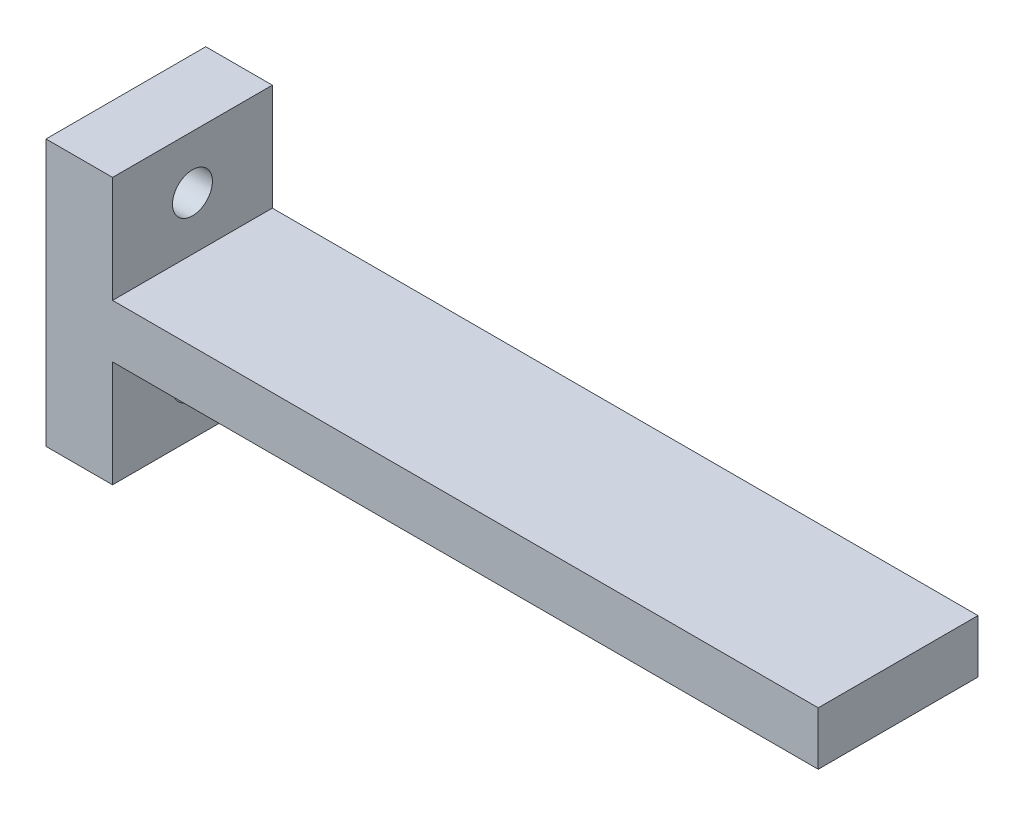
ISO-10303-21;
HEADER;
FILE_DESCRIPTION(('STEP AP214'),'2;1');
FILE_NAME('part.step','',(''),(''),'','','');
FILE_SCHEMA(('AUTOMOTIVE_DESIGN { 1 0 10303 214 1 1 1 1 }'));
ENDSEC;
DATA;
#1=APPLICATION_CONTEXT('core data for automotive mechanical design processes');
#2=APPLICATION_PROTOCOL_DEFINITION('international standard','automotive_design',2000,#1);
#3=PRODUCT_CONTEXT('',#1,'mechanical');
#4=PRODUCT('Part','Part','',(#3));
#5=PRODUCT_RELATED_PRODUCT_CATEGORY('part','',(#4));
#6=PRODUCT_DEFINITION_FORMATION('','',#4);
#7=PRODUCT_DEFINITION_CONTEXT('part definition',#1,'design');
#8=PRODUCT_DEFINITION('design','',#6,#7);
#9=PRODUCT_DEFINITION_SHAPE('','',#8);
#10=(LENGTH_UNIT() NAMED_UNIT(*) SI_UNIT(.MILLI.,.METRE.));
#11=(NAMED_UNIT(*) PLANE_ANGLE_UNIT() SI_UNIT($,.RADIAN.));
#12=(NAMED_UNIT(*) SI_UNIT($,.STERADIAN.) SOLID_ANGLE_UNIT());
#13=UNCERTAINTY_MEASURE_WITH_UNIT(LENGTH_MEASURE(1.E-05),#10,'distance_accuracy_value','');
#14=(GEOMETRIC_REPRESENTATION_CONTEXT(3) GLOBAL_UNCERTAINTY_ASSIGNED_CONTEXT((#13)) GLOBAL_UNIT_ASSIGNED_CONTEXT((#10,
#11,#12)) REPRESENTATION_CONTEXT('',''));
#15=CARTESIAN_POINT('',(0.,0.,0.));
#16=DIRECTION('',(0.,0.,1.));
#17=DIRECTION('',(1.,0.,0.));
#18=AXIS2_PLACEMENT_3D('',#15,#16,#17);
#19=CARTESIAN_POINT('',(-26.5,2.,6.));
#20=DIRECTION('',(0.,0.,-1.));
#21=DIRECTION('',(-1.,0.,0.));
#22=AXIS2_PLACEMENT_3D('',#19,#20,#21);
#23=PLANE('',#22);
#24=DIRECTION('',(1.,0.,0.));
#25=VECTOR('',#24,1.);
#26=CARTESIAN_POINT('',(-26.5,-2.,6.));
#27=LINE('',#26,#25);
#28=CARTESIAN_POINT('',(-26.5,-2.,6.));
#29=VERTEX_POINT('',#28);
#30=CARTESIAN_POINT('',(26.5,-2.,6.));
#31=VERTEX_POINT('',#30);
#32=EDGE_CURVE('E62',#29,#31,#27,.T.);
#33=ORIENTED_EDGE('',*,*,#32,.T.);
#34=DIRECTION('',(0.,-1.,0.));
#35=VECTOR('',#34,1.);
#36=CARTESIAN_POINT('',(26.5,2.,6.));
#37=LINE('',#36,#35);
#38=CARTESIAN_POINT('',(26.5,2.,6.));
#39=VERTEX_POINT('',#38);
#40=EDGE_CURVE('E11',#39,#31,#37,.T.);
#41=ORIENTED_EDGE('',*,*,#40,.F.);
#42=DIRECTION('',(1.,0.,0.));
#43=VECTOR('',#42,1.);
#44=CARTESIAN_POINT('',(-26.5,2.,6.));
#45=LINE('',#44,#43);
#46=CARTESIAN_POINT('',(-26.5,2.,6.));
#47=VERTEX_POINT('',#46);
#48=EDGE_CURVE('E96',#47,#39,#45,.T.);
#49=ORIENTED_EDGE('',*,*,#48,.F.);
#50=DIRECTION('',(0.,1.,0.));
#51=VECTOR('',#50,1.);
#52=CARTESIAN_POINT('',(-26.5,10.,6.));
#53=LINE('',#52,#51);
#54=CARTESIAN_POINT('',(-26.5,10.,6.));
#55=VERTEX_POINT('',#54);
#56=EDGE_CURVE('E80',#47,#55,#53,.T.);
#57=ORIENTED_EDGE('',*,*,#56,.T.);
#58=DIRECTION('',(1.,0.,0.));
#59=VECTOR('',#58,1.);
#60=CARTESIAN_POINT('',(-31.5,10.,6.));
#61=LINE('',#60,#59);
#62=CARTESIAN_POINT('',(-31.5,10.,6.));
#63=VERTEX_POINT('',#62);
#64=EDGE_CURVE('E197',#63,#55,#61,.T.);
#65=ORIENTED_EDGE('',*,*,#64,.F.);
#66=DIRECTION('',(0.,1.,0.));
#67=VECTOR('',#66,1.);
#68=CARTESIAN_POINT('',(-31.5,10.,6.));
#69=LINE('',#68,#67);
#70=CARTESIAN_POINT('',(-31.5,-10.,6.));
#71=VERTEX_POINT('',#70);
#72=EDGE_CURVE('E183',#71,#63,#69,.T.);
#73=ORIENTED_EDGE('',*,*,#72,.F.);
#74=DIRECTION('',(1.,0.,0.));
#75=VECTOR('',#74,1.);
#76=CARTESIAN_POINT('',(-31.5,-10.,6.));
#77=LINE('',#76,#75);
#78=CARTESIAN_POINT('',(-26.5,-10.,6.));
#79=VERTEX_POINT('',#78);
#80=EDGE_CURVE('E198',#71,#79,#77,.T.);
#81=ORIENTED_EDGE('',*,*,#80,.T.);
#82=EDGE_CURVE('E93',#79,#29,#53,.T.);
#83=ORIENTED_EDGE('',*,*,#82,.T.);
#84=EDGE_LOOP('',(#33,#41,#49,#57,#65,#73,#81,#83));
#85=FACE_BOUND('',#84,.T.);
#86=ADVANCED_FACE('F34',(#85),#23,.F.);
#87=CARTESIAN_POINT('',(26.5,2.,-6.));
#88=DIRECTION('',(-1.,0.,0.));
#89=DIRECTION('',(0.,0.,1.));
#90=AXIS2_PLACEMENT_3D('',#87,#88,#89);
#91=PLANE('',#90);
#92=DIRECTION('',(0.,0.,-1.));
#93=VECTOR('',#92,1.);
#94=CARTESIAN_POINT('',(26.5,-2.,-6.));
#95=LINE('',#94,#93);
#96=CARTESIAN_POINT('',(26.5,-2.,-6.));
#97=VERTEX_POINT('',#96);
#98=EDGE_CURVE('E104',#31,#97,#95,.T.);
#99=ORIENTED_EDGE('',*,*,#98,.T.);
#100=DIRECTION('',(0.,-1.,0.));
#101=VECTOR('',#100,1.);
#102=CARTESIAN_POINT('',(26.5,2.,-6.));
#103=LINE('',#102,#101);
#104=CARTESIAN_POINT('',(26.5,2.,-6.));
#105=VERTEX_POINT('',#104);
#106=EDGE_CURVE('E42',#105,#97,#103,.T.);
#107=ORIENTED_EDGE('',*,*,#106,.F.);
#108=DIRECTION('',(0.,0.,-1.));
#109=VECTOR('',#108,1.);
#110=CARTESIAN_POINT('',(26.5,2.,-6.));
#111=LINE('',#110,#109);
#112=EDGE_CURVE('E50',#39,#105,#111,.T.);
#113=ORIENTED_EDGE('',*,*,#112,.F.);
#114=ORIENTED_EDGE('',*,*,#40,.T.);
#115=EDGE_LOOP('',(#99,#107,#113,#114));
#116=FACE_BOUND('',#115,.T.);
#117=ADVANCED_FACE('F123',(#116),#91,.F.);
#118=CARTESIAN_POINT('',(-26.5,2.,-6.));
#119=DIRECTION('',(0.,0.,1.));
#120=DIRECTION('',(1.,0.,0.));
#121=AXIS2_PLACEMENT_3D('',#118,#119,#120);
#122=PLANE('',#121);
#123=DIRECTION('',(-1.,0.,0.));
#124=VECTOR('',#123,1.);
#125=CARTESIAN_POINT('',(-26.5,-2.,-6.));
#126=LINE('',#125,#124);
#127=CARTESIAN_POINT('',(-26.5,-2.,-6.));
#128=VERTEX_POINT('',#127);
#129=EDGE_CURVE('E101',#97,#128,#126,.T.);
#130=ORIENTED_EDGE('',*,*,#129,.T.);
#131=DIRECTION('',(0.,-1.,0.));
#132=VECTOR('',#131,1.);
#133=CARTESIAN_POINT('',(-26.5,10.,-6.));
#134=LINE('',#133,#132);
#135=CARTESIAN_POINT('',(-26.5,-10.,-6.));
#136=VERTEX_POINT('',#135);
#137=EDGE_CURVE('E174',#128,#136,#134,.T.);
#138=ORIENTED_EDGE('',*,*,#137,.T.);
#139=DIRECTION('',(1.,0.,0.));
#140=VECTOR('',#139,1.);
#141=CARTESIAN_POINT('',(-31.5,-10.,-6.));
#142=LINE('',#141,#140);
#143=CARTESIAN_POINT('',(-31.5,-10.,-6.));
#144=VERTEX_POINT('',#143);
#145=EDGE_CURVE('E107',#144,#136,#142,.T.);
#146=ORIENTED_EDGE('',*,*,#145,.F.);
#147=DIRECTION('',(0.,-1.,0.));
#148=VECTOR('',#147,1.);
#149=CARTESIAN_POINT('',(-31.5,10.,-6.));
#150=LINE('',#149,#148);
#151=CARTESIAN_POINT('',(-31.5,10.,-6.));
#152=VERTEX_POINT('',#151);
#153=EDGE_CURVE('E177',#152,#144,#150,.T.);
#154=ORIENTED_EDGE('',*,*,#153,.F.);
#155=DIRECTION('',(1.,0.,0.));
#156=VECTOR('',#155,1.);
#157=CARTESIAN_POINT('',(-31.5,10.,-6.));
#158=LINE('',#157,#156);
#159=CARTESIAN_POINT('',(-26.5,10.,-6.));
#160=VERTEX_POINT('',#159);
#161=EDGE_CURVE('E189',#152,#160,#158,.T.);
#162=ORIENTED_EDGE('',*,*,#161,.T.);
#163=CARTESIAN_POINT('',(-26.5,2.,-6.));
#164=VERTEX_POINT('',#163);
#165=EDGE_CURVE('E190',#160,#164,#134,.T.);
#166=ORIENTED_EDGE('',*,*,#165,.T.);
#167=DIRECTION('',(-1.,0.,0.));
#168=VECTOR('',#167,1.);
#169=CARTESIAN_POINT('',(-26.5,2.,-6.));
#170=LINE('',#169,#168);
#171=EDGE_CURVE('E100',#105,#164,#170,.T.);
#172=ORIENTED_EDGE('',*,*,#171,.F.);
#173=ORIENTED_EDGE('',*,*,#106,.T.);
#174=EDGE_LOOP('',(#130,#138,#146,#154,#162,#166,#172,#173));
#175=FACE_BOUND('',#174,.T.);
#176=ADVANCED_FACE('F117',(#175),#122,.F.);
#177=CARTESIAN_POINT('',(0.,2.,0.));
#178=DIRECTION('',(0.,1.,0.));
#179=DIRECTION('',(0.,0.,1.));
#180=AXIS2_PLACEMENT_3D('',#177,#178,#179);
#181=PLANE('',#180);
#182=DIRECTION('',(0.,0.,1.));
#183=VECTOR('',#182,1.);
#184=CARTESIAN_POINT('',(-26.5,2.,-6.));
#185=LINE('',#184,#183);
#186=EDGE_CURVE('E86',#164,#47,#185,.T.);
#187=ORIENTED_EDGE('',*,*,#186,.T.);
#188=ORIENTED_EDGE('',*,*,#48,.T.);
#189=ORIENTED_EDGE('',*,*,#112,.T.);
#190=ORIENTED_EDGE('',*,*,#171,.T.);
#191=EDGE_LOOP('',(#187,#188,#189,#190));
#192=FACE_BOUND('',#191,.T.);
#193=ADVANCED_FACE('F98',(#192),#181,.T.);
#194=CARTESIAN_POINT('',(0.,-2.,0.));
#195=DIRECTION('',(0.,1.,0.));
#196=DIRECTION('',(0.,0.,1.));
#197=AXIS2_PLACEMENT_3D('',#194,#195,#196);
#198=PLANE('',#197);
#199=DIRECTION('',(0.,0.,1.));
#200=VECTOR('',#199,1.);
#201=CARTESIAN_POINT('',(-26.5,-2.,-6.));
#202=LINE('',#201,#200);
#203=EDGE_CURVE('E71',#128,#29,#202,.T.);
#204=ORIENTED_EDGE('',*,*,#203,.F.);
#205=ORIENTED_EDGE('',*,*,#129,.F.);
#206=ORIENTED_EDGE('',*,*,#98,.F.);
#207=ORIENTED_EDGE('',*,*,#32,.F.);
#208=EDGE_LOOP('',(#204,#205,#206,#207));
#209=FACE_BOUND('',#208,.T.);
#210=ADVANCED_FACE('F122',(#209),#198,.F.);
#211=CARTESIAN_POINT('',(-26.5,0.,0.));
#212=DIRECTION('',(-1.,0.,0.));
#213=DIRECTION('',(0.,0.,1.));
#214=AXIS2_PLACEMENT_3D('',#211,#212,#213);
#215=PLANE('',#214);
#216=CARTESIAN_POINT('',(-26.5,-6.,0.));
#217=DIRECTION('',(-1.,0.,0.));
#218=DIRECTION('',(0.,0.,1.));
#219=AXIS2_PLACEMENT_3D('',#216,#217,#218);
#220=CIRCLE('',#219,1.5);
#221=CARTESIAN_POINT('',(-26.5,-6.,1.5));
#222=VERTEX_POINT('',#221);
#223=EDGE_CURVE('E165',#222,#222,#220,.T.);
#224=ORIENTED_EDGE('',*,*,#223,.T.);
#225=EDGE_LOOP('',(#224));
#226=FACE_BOUND('',#225,.T.);
#227=ORIENTED_EDGE('',*,*,#137,.F.);
#228=ORIENTED_EDGE('',*,*,#203,.T.);
#229=ORIENTED_EDGE('',*,*,#82,.F.);
#230=DIRECTION('',(0.,0.,1.));
#231=VECTOR('',#230,1.);
#232=CARTESIAN_POINT('',(-26.5,-10.,-6.));
#233=LINE('',#232,#231);
#234=EDGE_CURVE('E94',#136,#79,#233,.T.);
#235=ORIENTED_EDGE('',*,*,#234,.F.);
#236=EDGE_LOOP('',(#227,#228,#229,#235));
#237=FACE_BOUND('',#236,.T.);
#238=ADVANCED_FACE('F133',(#226,#237),#215,.F.);
#239=CARTESIAN_POINT('',(-31.5,0.,0.));
#240=DIRECTION('',(-1.,0.,0.));
#241=DIRECTION('',(0.,0.,1.));
#242=AXIS2_PLACEMENT_3D('',#239,#240,#241);
#243=PLANE('',#242);
#244=CARTESIAN_POINT('',(-31.5,6.,0.));
#245=DIRECTION('',(-1.,0.,0.));
#246=DIRECTION('',(0.,0.,1.));
#247=AXIS2_PLACEMENT_3D('',#244,#245,#246);
#248=CIRCLE('',#247,1.5);
#249=CARTESIAN_POINT('',(-31.5,6.,1.5));
#250=VERTEX_POINT('',#249);
#251=EDGE_CURVE('E171',#250,#250,#248,.T.);
#252=ORIENTED_EDGE('',*,*,#251,.F.);
#253=EDGE_LOOP('',(#252));
#254=FACE_BOUND('',#253,.T.);
#255=ORIENTED_EDGE('',*,*,#153,.T.);
#256=DIRECTION('',(0.,0.,1.));
#257=VECTOR('',#256,1.);
#258=CARTESIAN_POINT('',(-31.5,-10.,-6.));
#259=LINE('',#258,#257);
#260=EDGE_CURVE('E180',#144,#71,#259,.T.);
#261=ORIENTED_EDGE('',*,*,#260,.T.);
#262=ORIENTED_EDGE('',*,*,#72,.T.);
#263=DIRECTION('',(0.,0.,-1.));
#264=VECTOR('',#263,1.);
#265=CARTESIAN_POINT('',(-31.5,10.,-6.));
#266=LINE('',#265,#264);
#267=EDGE_CURVE('E186',#63,#152,#266,.T.);
#268=ORIENTED_EDGE('',*,*,#267,.T.);
#269=EDGE_LOOP('',(#255,#261,#262,#268));
#270=FACE_BOUND('',#269,.T.);
#271=CARTESIAN_POINT('',(-31.5,-6.,0.));
#272=DIRECTION('',(-1.,0.,0.));
#273=DIRECTION('',(0.,0.,1.));
#274=AXIS2_PLACEMENT_3D('',#271,#272,#273);
#275=CIRCLE('',#274,1.5);
#276=CARTESIAN_POINT('',(-31.5,-6.,1.5));
#277=VERTEX_POINT('',#276);
#278=EDGE_CURVE('E162',#277,#277,#275,.T.);
#279=ORIENTED_EDGE('',*,*,#278,.F.);
#280=EDGE_LOOP('',(#279));
#281=FACE_BOUND('',#280,.T.);
#282=ADVANCED_FACE('F147',(#254,#270,#281),#243,.T.);
#283=ORIENTED_EDGE('',*,*,#186,.F.);
#284=ORIENTED_EDGE('',*,*,#165,.F.);
#285=DIRECTION('',(0.,0.,-1.));
#286=VECTOR('',#285,1.);
#287=CARTESIAN_POINT('',(-26.5,10.,-6.));
#288=LINE('',#287,#286);
#289=EDGE_CURVE('E90',#55,#160,#288,.T.);
#290=ORIENTED_EDGE('',*,*,#289,.F.);
#291=ORIENTED_EDGE('',*,*,#56,.F.);
#292=EDGE_LOOP('',(#283,#284,#290,#291));
#293=FACE_BOUND('',#292,.T.);
#294=CARTESIAN_POINT('',(-26.5,6.,0.));
#295=DIRECTION('',(-1.,0.,0.));
#296=DIRECTION('',(0.,0.,1.));
#297=AXIS2_PLACEMENT_3D('',#294,#295,#296);
#298=CIRCLE('',#297,1.5);
#299=CARTESIAN_POINT('',(-26.5,6.,1.5));
#300=VERTEX_POINT('',#299);
#301=EDGE_CURVE('E168',#300,#300,#298,.T.);
#302=ORIENTED_EDGE('',*,*,#301,.T.);
#303=EDGE_LOOP('',(#302));
#304=FACE_BOUND('',#303,.T.);
#305=ADVANCED_FACE('F82',(#293,#304),#215,.F.);
#306=CARTESIAN_POINT('',(-31.5,-10.,-6.));
#307=DIRECTION('',(0.,1.,0.));
#308=DIRECTION('',(0.,0.,1.));
#309=AXIS2_PLACEMENT_3D('',#306,#307,#308);
#310=PLANE('',#309);
#311=ORIENTED_EDGE('',*,*,#234,.T.);
#312=ORIENTED_EDGE('',*,*,#80,.F.);
#313=ORIENTED_EDGE('',*,*,#260,.F.);
#314=ORIENTED_EDGE('',*,*,#145,.T.);
#315=EDGE_LOOP('',(#311,#312,#313,#314));
#316=FACE_BOUND('',#315,.T.);
#317=ADVANCED_FACE('F136',(#316),#310,.F.);
#318=CARTESIAN_POINT('',(-31.5,10.,-6.));
#319=DIRECTION('',(0.,-1.,0.));
#320=DIRECTION('',(0.,0.,-1.));
#321=AXIS2_PLACEMENT_3D('',#318,#319,#320);
#322=PLANE('',#321);
#323=ORIENTED_EDGE('',*,*,#289,.T.);
#324=ORIENTED_EDGE('',*,*,#161,.F.);
#325=ORIENTED_EDGE('',*,*,#267,.F.);
#326=ORIENTED_EDGE('',*,*,#64,.T.);
#327=EDGE_LOOP('',(#323,#324,#325,#326));
#328=FACE_BOUND('',#327,.T.);
#329=ADVANCED_FACE('F139',(#328),#322,.F.);
#330=CARTESIAN_POINT('',(-31.5,6.,0.));
#331=DIRECTION('',(1.,0.,0.));
#332=DIRECTION('',(0.,0.,-1.));
#333=AXIS2_PLACEMENT_3D('',#330,#331,#332);
#334=CYLINDRICAL_SURFACE('',#333,1.5);
#335=ORIENTED_EDGE('',*,*,#251,.T.);
#336=EDGE_LOOP('',(#335));
#337=FACE_BOUND('',#336,.T.);
#338=ORIENTED_EDGE('',*,*,#301,.F.);
#339=EDGE_LOOP('',(#338));
#340=FACE_BOUND('',#339,.T.);
#341=ADVANCED_FACE('F143',(#337,#340),#334,.F.);
#342=CARTESIAN_POINT('',(-31.5,-6.,0.));
#343=DIRECTION('',(1.,0.,0.));
#344=DIRECTION('',(0.,0.,-1.));
#345=AXIS2_PLACEMENT_3D('',#342,#343,#344);
#346=CYLINDRICAL_SURFACE('',#345,1.5);
#347=ORIENTED_EDGE('',*,*,#278,.T.);
#348=EDGE_LOOP('',(#347));
#349=FACE_BOUND('',#348,.T.);
#350=ORIENTED_EDGE('',*,*,#223,.F.);
#351=EDGE_LOOP('',(#350));
#352=FACE_BOUND('',#351,.T.);
#353=ADVANCED_FACE('F153',(#349,#352),#346,.F.);
#354=CLOSED_SHELL('',(#86,#117,#176,#193,#210,#238,#282,#305,#317,#329,#341,#353));
#355=MANIFOLD_SOLID_BREP('B2',#354);
#356=ADVANCED_BREP_SHAPE_REPRESENTATION('',(#18,#355),#14);
#357=SHAPE_DEFINITION_REPRESENTATION(#9,#356);
ENDSEC;
END-ISO-10303-21;
